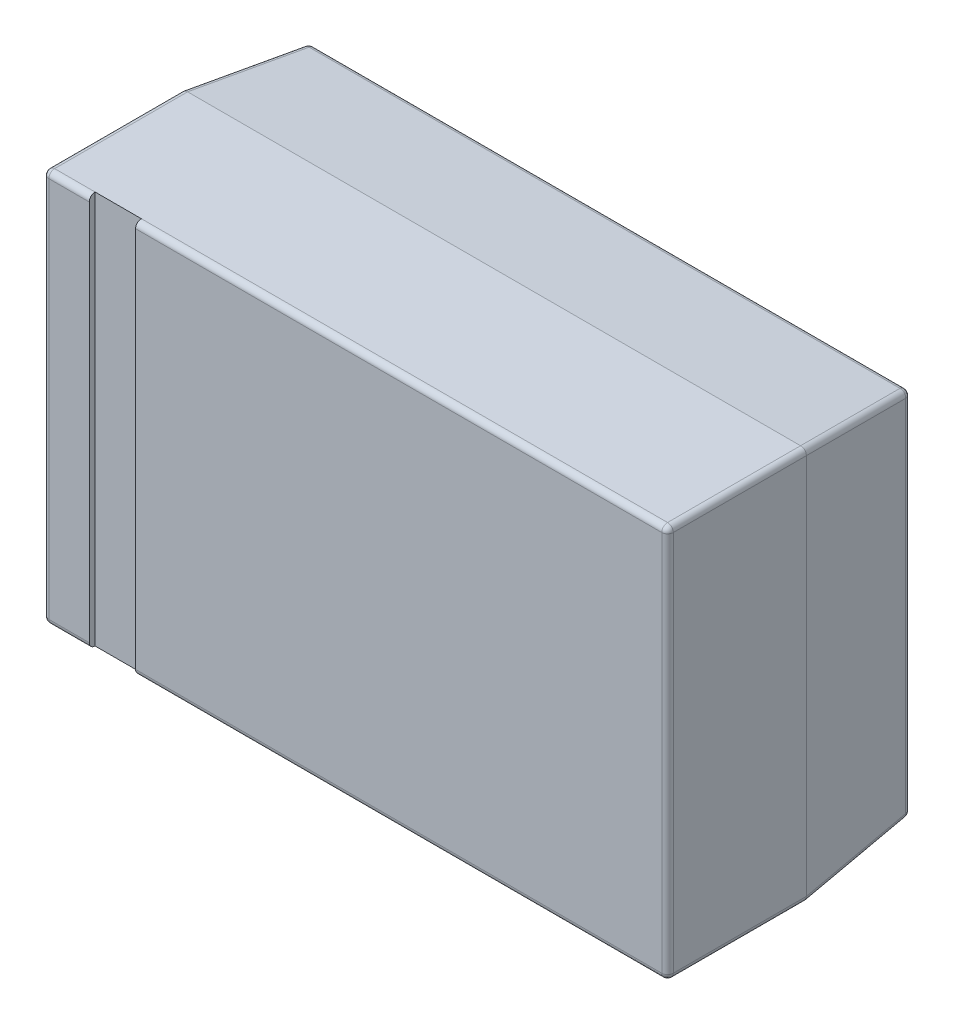
ISO-10303-21;
HEADER;
FILE_DESCRIPTION(('STEP AP214'),'2;1');
FILE_NAME('part.step','',(''),(''),'','','');
FILE_SCHEMA(('AUTOMOTIVE_DESIGN { 1 0 10303 214 1 1 1 1 }'));
ENDSEC;
DATA;
#1=APPLICATION_CONTEXT('core data for automotive mechanical design processes');
#2=APPLICATION_PROTOCOL_DEFINITION('international standard','automotive_design',2000,#1);
#3=PRODUCT_CONTEXT('',#1,'mechanical');
#4=PRODUCT('Part','Part','',(#3));
#5=PRODUCT_RELATED_PRODUCT_CATEGORY('part','',(#4));
#6=PRODUCT_DEFINITION_FORMATION('','',#4);
#7=PRODUCT_DEFINITION_CONTEXT('part definition',#1,'design');
#8=PRODUCT_DEFINITION('design','',#6,#7);
#9=PRODUCT_DEFINITION_SHAPE('','',#8);
#10=(LENGTH_UNIT() NAMED_UNIT(*) SI_UNIT(.MILLI.,.METRE.));
#11=(NAMED_UNIT(*) PLANE_ANGLE_UNIT() SI_UNIT($,.RADIAN.));
#12=(NAMED_UNIT(*) SI_UNIT($,.STERADIAN.) SOLID_ANGLE_UNIT());
#13=UNCERTAINTY_MEASURE_WITH_UNIT(LENGTH_MEASURE(1.E-05),#10,'distance_accuracy_value','');
#14=(GEOMETRIC_REPRESENTATION_CONTEXT(3) GLOBAL_UNCERTAINTY_ASSIGNED_CONTEXT((#13)) GLOBAL_UNIT_ASSIGNED_CONTEXT((#10,
#11,#12)) REPRESENTATION_CONTEXT('',''));
#15=CARTESIAN_POINT('',(0.,0.,0.));
#16=DIRECTION('',(0.,0.,1.));
#17=DIRECTION('',(1.,0.,0.));
#18=AXIS2_PLACEMENT_3D('',#15,#16,#17);
#19=CARTESIAN_POINT('',(1.2783753109472,-0.778375310947198,0.1));
#20=DIRECTION('',(0.,0.,-1.));
#21=DIRECTION('',(-1.,0.,0.));
#22=AXIS2_PLACEMENT_3D('',#19,#20,#21);
#23=PLANE('',#22);
#24=DIRECTION('',(1.,0.,0.));
#25=VECTOR('',#24,1.);
#26=CARTESIAN_POINT('',(0.,-0.777375310947198,0.1));
#27=LINE('',#26,#25);
#28=CARTESIAN_POINT('',(-1.2773753109472,-0.777375310947231,0.1));
#29=VERTEX_POINT('',#28);
#30=CARTESIAN_POINT('',(1.2773753109472,-0.777375310947198,0.1));
#31=VERTEX_POINT('',#30);
#32=EDGE_CURVE('E198',#29,#31,#27,.T.);
#33=ORIENTED_EDGE('',*,*,#32,.F.);
#34=DIRECTION('',(0.,1.,0.));
#35=VECTOR('',#34,1.);
#36=CARTESIAN_POINT('',(-1.2773753109472,0.,0.1));
#37=LINE('',#36,#35);
#38=CARTESIAN_POINT('',(-1.27737531094719,0.777375310947198,0.1));
#39=VERTEX_POINT('',#38);
#40=EDGE_CURVE('E145',#29,#39,#37,.T.);
#41=ORIENTED_EDGE('',*,*,#40,.T.);
#42=DIRECTION('',(-1.,0.,0.));
#43=VECTOR('',#42,1.);
#44=CARTESIAN_POINT('',(0.,0.777375310947198,0.1));
#45=LINE('',#44,#43);
#46=CARTESIAN_POINT('',(1.2773753109472,0.777375310947197,0.1));
#47=VERTEX_POINT('',#46);
#48=EDGE_CURVE('E144',#47,#39,#45,.T.);
#49=ORIENTED_EDGE('',*,*,#48,.F.);
#50=DIRECTION('',(0.,-1.,0.));
#51=VECTOR('',#50,1.);
#52=CARTESIAN_POINT('',(1.2773753109472,0.,0.1));
#53=LINE('',#52,#51);
#54=EDGE_CURVE('E209',#47,#31,#53,.T.);
#55=ORIENTED_EDGE('',*,*,#54,.T.);
#56=EDGE_LOOP('',(#33,#41,#49,#55));
#57=FACE_BOUND('',#56,.T.);
#58=ADVANCED_FACE('F17',(#57),#23,.T.);
#59=CARTESIAN_POINT('',(1.2773753109472,0.777375310947199,0.124999999999998));
#60=DIRECTION('',(0.343720256421982,-0.842800358685457,-0.41417863383433));
#61=DIRECTION('',(-0.156407681747957,0.383510857493112,-0.910195615939303));
#62=AXIS2_PLACEMENT_3D('',#59,#60,#61);
#63=SPHERICAL_SURFACE('',#62,0.0249999999999989);
#64=CARTESIAN_POINT('',(1.2773753109472,0.777375310947198,0.125));
#65=DIRECTION('',(1.,0.,0.));
#66=DIRECTION('',(0.,0.,-1.));
#67=AXIS2_PLACEMENT_3D('',#64,#65,#66);
#68=CIRCLE('',#67,0.0250000000000002);
#69=CARTESIAN_POINT('',(1.2773753109472,0.802251240702447,0.122512407024475));
#70=VERTEX_POINT('',#69);
#71=EDGE_CURVE('E21',#70,#47,#68,.F.);
#72=ORIENTED_EDGE('',*,*,#71,.F.);
#73=CARTESIAN_POINT('',(1.2773753109472,0.777375310947196,0.125));
#74=DIRECTION('',(-0.0990147542976653,-0.0990147542976635,-0.990147542976675));
#75=DIRECTION('',(-0.995037190209989,0.,0.0995037190209967));
#76=AXIS2_PLACEMENT_3D('',#73,#74,#75);
#77=CIRCLE('',#76,0.0250000000000023);
#78=CARTESIAN_POINT('',(1.30225124070245,0.777375310947197,0.122512407024475));
#79=VERTEX_POINT('',#78);
#80=EDGE_CURVE('E138',#79,#70,#77,.F.);
#81=ORIENTED_EDGE('',*,*,#80,.F.);
#82=CARTESIAN_POINT('',(1.2773753109472,0.777375310947197,0.125000000000002));
#83=DIRECTION('',(0.,-1.,0.));
#84=DIRECTION('',(0.,0.,-1.));
#85=AXIS2_PLACEMENT_3D('',#82,#83,#84);
#86=CIRCLE('',#85,0.0250000000000014);
#87=EDGE_CURVE('E140',#47,#79,#86,.T.);
#88=ORIENTED_EDGE('',*,*,#87,.F.);
#89=EDGE_LOOP('',(#72,#81,#88));
#90=FACE_BOUND('',#89,.T.);
#91=ADVANCED_FACE('F136',(#90),#63,.T.);
#92=CARTESIAN_POINT('',(1.2773753109472,-0.777375310947198,0.124999999999997));
#93=DIRECTION('',(-0.343720256422158,-0.842800358685331,0.414178633834441));
#94=DIRECTION('',(-0.156407681747989,-0.383510857493218,-0.910195615939253));
#95=AXIS2_PLACEMENT_3D('',#92,#93,#94);
#96=SPHERICAL_SURFACE('',#95,0.0249999999999985);
#97=CARTESIAN_POINT('',(1.2773753109472,-0.777375310947198,0.125));
#98=DIRECTION('',(-1.,0.,0.));
#99=DIRECTION('',(0.,0.,1.));
#100=AXIS2_PLACEMENT_3D('',#97,#98,#99);
#101=CIRCLE('',#100,0.0250000000000002);
#102=CARTESIAN_POINT('',(1.2773753109472,-0.802251240702437,0.122512407024476));
#103=VERTEX_POINT('',#102);
#104=EDGE_CURVE('E199',#31,#103,#101,.T.);
#105=ORIENTED_EDGE('',*,*,#104,.F.);
#106=CARTESIAN_POINT('',(1.2773753109472,-0.777375310947198,0.125000000000002));
#107=DIRECTION('',(0.,-1.,0.));
#108=DIRECTION('',(0.,0.,-1.));
#109=AXIS2_PLACEMENT_3D('',#106,#107,#108);
#110=CIRCLE('',#109,0.0250000000000014);
#111=CARTESIAN_POINT('',(1.30225124070245,-0.777375310947202,0.122512407024475));
#112=VERTEX_POINT('',#111);
#113=EDGE_CURVE('E168',#112,#31,#110,.F.);
#114=ORIENTED_EDGE('',*,*,#113,.F.);
#115=CARTESIAN_POINT('',(1.2773753109472,-0.777375310947176,0.125000000000003));
#116=DIRECTION('',(-0.0990147542976614,0.0990147542977063,-0.990147542976671));
#117=DIRECTION('',(0.,0.995037190209985,0.0995037190210379));
#118=AXIS2_PLACEMENT_3D('',#115,#116,#117);
#119=CIRCLE('',#118,0.0250000000000009);
#120=EDGE_CURVE('E167',#103,#112,#119,.F.);
#121=ORIENTED_EDGE('',*,*,#120,.F.);
#122=EDGE_LOOP('',(#105,#114,#121));
#123=FACE_BOUND('',#122,.T.);
#124=ADVANCED_FACE('F448',(#123),#96,.T.);
#125=CARTESIAN_POINT('',(-1.2773753109472,0.777375310947198,0.125));
#126=DIRECTION('',(1.,0.,0.));
#127=DIRECTION('',(0.,0.,-1.));
#128=AXIS2_PLACEMENT_3D('',#125,#126,#127);
#129=CYLINDRICAL_SURFACE('',#128,0.0250000000000002);
#130=ORIENTED_EDGE('',*,*,#71,.T.);
#131=ORIENTED_EDGE('',*,*,#48,.T.);
#132=CARTESIAN_POINT('',(-1.27737531094717,0.777375310947198,0.125));
#133=DIRECTION('',(1.,0.,0.));
#134=DIRECTION('',(0.,0.,-1.));
#135=AXIS2_PLACEMENT_3D('',#132,#133,#134);
#136=CIRCLE('',#135,0.0250000000000002);
#137=CARTESIAN_POINT('',(-1.27737531094718,0.802251240702443,0.122512407024477));
#138=VERTEX_POINT('',#137);
#139=EDGE_CURVE('E150',#138,#39,#136,.F.);
#140=ORIENTED_EDGE('',*,*,#139,.F.);
#141=DIRECTION('',(-1.,0.,0.));
#142=VECTOR('',#141,1.);
#143=CARTESIAN_POINT('',(0.,0.802251240702447,0.122512407024475));
#144=LINE('',#143,#142);
#145=EDGE_CURVE('E147',#70,#138,#144,.T.);
#146=ORIENTED_EDGE('',*,*,#145,.F.);
#147=EDGE_LOOP('',(#130,#131,#140,#146));
#148=FACE_BOUND('',#147,.T.);
#149=ADVANCED_FACE('F148',(#148),#129,.T.);
#150=CARTESIAN_POINT('',(1.2773753109472,-0.777375310947198,0.125));
#151=DIRECTION('',(-1.,0.,0.));
#152=DIRECTION('',(0.,0.,1.));
#153=AXIS2_PLACEMENT_3D('',#150,#151,#152);
#154=CYLINDRICAL_SURFACE('',#153,0.0250000000000002);
#155=CARTESIAN_POINT('',(-1.2773753109472,-0.777375310947198,0.125));
#156=DIRECTION('',(-1.,0.,0.));
#157=DIRECTION('',(0.,0.,1.));
#158=AXIS2_PLACEMENT_3D('',#155,#156,#157);
#159=CIRCLE('',#158,0.0250000000000002);
#160=CARTESIAN_POINT('',(-1.27737531094718,-0.802251240702447,0.122512407024475));
#161=VERTEX_POINT('',#160);
#162=EDGE_CURVE('E156',#29,#161,#159,.T.);
#163=ORIENTED_EDGE('',*,*,#162,.F.);
#164=ORIENTED_EDGE('',*,*,#32,.T.);
#165=ORIENTED_EDGE('',*,*,#104,.T.);
#166=DIRECTION('',(1.,0.,0.));
#167=VECTOR('',#166,1.);
#168=CARTESIAN_POINT('',(0.,-0.802251240702447,0.122512407024475));
#169=LINE('',#168,#167);
#170=EDGE_CURVE('E174',#161,#103,#169,.T.);
#171=ORIENTED_EDGE('',*,*,#170,.F.);
#172=EDGE_LOOP('',(#163,#164,#165,#171));
#173=FACE_BOUND('',#172,.T.);
#174=ADVANCED_FACE('F441',(#173),#154,.T.);
#175=CARTESIAN_POINT('',(1.2773753109472,0.777375310947198,0.125000000000002));
#176=DIRECTION('',(0.,-1.,0.));
#177=DIRECTION('',(0.,0.,-1.));
#178=AXIS2_PLACEMENT_3D('',#175,#176,#177);
#179=CYLINDRICAL_SURFACE('',#178,0.0250000000000014);
#180=ORIENTED_EDGE('',*,*,#113,.T.);
#181=ORIENTED_EDGE('',*,*,#54,.F.);
#182=ORIENTED_EDGE('',*,*,#87,.T.);
#183=DIRECTION('',(0.,1.,0.));
#184=VECTOR('',#183,1.);
#185=CARTESIAN_POINT('',(1.30225124070245,0.,0.122512407024475));
#186=LINE('',#185,#184);
#187=EDGE_CURVE('E327',#112,#79,#186,.T.);
#188=ORIENTED_EDGE('',*,*,#187,.F.);
#189=EDGE_LOOP('',(#180,#181,#182,#188));
#190=FACE_BOUND('',#189,.T.);
#191=ADVANCED_FACE('F446',(#190),#179,.T.);
#192=CARTESIAN_POINT('',(1.325,0.824999999999997,0.601246890528024));
#193=DIRECTION('',(-0.0990147542976653,-0.0990147542976635,-0.990147542976675));
#194=DIRECTION('',(-0.995037190209989,0.,0.0995037190209967));
#195=AXIS2_PLACEMENT_3D('',#192,#193,#194);
#196=CYLINDRICAL_SURFACE('',#195,0.0250000000000023);
#197=ORIENTED_EDGE('',*,*,#80,.T.);
#198=DIRECTION('',(-0.0990147542976628,-0.0990147542976693,-0.990147542976675));
#199=VECTOR('',#198,1.);
#200=CARTESIAN_POINT('',(1.325,0.84987592975525,0.598759297552498));
#201=LINE('',#200,#199);
#202=CARTESIAN_POINT('',(1.325,0.849937964877625,0.60000309404026));
#203=VERTEX_POINT('',#202);
#204=EDGE_CURVE('E155',#203,#70,#201,.T.);
#205=ORIENTED_EDGE('',*,*,#204,.F.);
#206=CARTESIAN_POINT('',(1.325,0.824999999999999,0.601246890528042));
#207=DIRECTION('',(-0.0496297718696279,-0.0496297718696271,-0.997533844783392));
#208=DIRECTION('',(0.705362946109432,0.70536294610942,-0.0701870964755097));
#209=AXIS2_PLACEMENT_3D('',#206,#207,#208);
#210=ELLIPSE('',#209,0.0250618063043563,0.0250000000000012);
#211=CARTESIAN_POINT('',(1.34993796487762,0.825,0.60000309404026));
#212=VERTEX_POINT('',#211);
#213=EDGE_CURVE('E333',#212,#203,#210,.F.);
#214=ORIENTED_EDGE('',*,*,#213,.F.);
#215=DIRECTION('',(0.0990147542976583,0.0990147542976696,0.990147542976675));
#216=VECTOR('',#215,1.);
#217=CARTESIAN_POINT('',(1.30225124070245,0.777375310947197,0.122512407024475));
#218=LINE('',#217,#216);
#219=EDGE_CURVE('E165',#79,#212,#218,.T.);
#220=ORIENTED_EDGE('',*,*,#219,.F.);
#221=EDGE_LOOP('',(#197,#205,#214,#220));
#222=FACE_BOUND('',#221,.T.);
#223=ADVANCED_FACE('F161',(#222),#196,.T.);
#224=CARTESIAN_POINT('',(1.325,-0.824999999999997,0.601246890528024));
#225=DIRECTION('',(-0.0990147542976614,0.0990147542977063,-0.990147542976671));
#226=DIRECTION('',(0.,0.995037190209985,0.0995037190210379));
#227=AXIS2_PLACEMENT_3D('',#224,#225,#226);
#228=CYLINDRICAL_SURFACE('',#227,0.0250000000000009);
#229=ORIENTED_EDGE('',*,*,#120,.T.);
#230=DIRECTION('',(-0.0990147542976583,0.0990147542976691,-0.990147542976675));
#231=VECTOR('',#230,1.);
#232=CARTESIAN_POINT('',(1.34987592975525,-0.825,0.598759297552498));
#233=LINE('',#232,#231);
#234=CARTESIAN_POINT('',(1.34993796487762,-0.825,0.600003094040261));
#235=VERTEX_POINT('',#234);
#236=EDGE_CURVE('E321',#235,#112,#233,.T.);
#237=ORIENTED_EDGE('',*,*,#236,.F.);
#238=CARTESIAN_POINT('',(1.325,-0.824999999999999,0.601246890528041));
#239=DIRECTION('',(-0.0496297718696261,0.0496297718696486,-0.997533844783392));
#240=DIRECTION('',(0.705362946109265,-0.705362946109585,-0.0701870964755227));
#241=AXIS2_PLACEMENT_3D('',#238,#239,#240);
#242=ELLIPSE('',#241,0.0250618063043556,0.0250000000000004);
#243=CARTESIAN_POINT('',(1.325,-0.849937964877625,0.60000309404026));
#244=VERTEX_POINT('',#243);
#245=EDGE_CURVE('E330',#244,#235,#242,.F.);
#246=ORIENTED_EDGE('',*,*,#245,.F.);
#247=DIRECTION('',(0.0990147542976844,-0.0990147542976691,0.990147542976673));
#248=VECTOR('',#247,1.);
#249=CARTESIAN_POINT('',(1.27737531094719,-0.802251240702447,0.122512407024476));
#250=LINE('',#249,#248);
#251=EDGE_CURVE('E177',#103,#244,#250,.T.);
#252=ORIENTED_EDGE('',*,*,#251,.F.);
#253=EDGE_LOOP('',(#229,#237,#246,#252));
#254=FACE_BOUND('',#253,.T.);
#255=ADVANCED_FACE('F449',(#254),#228,.T.);
#256=CARTESIAN_POINT('',(-1.2773753109472,0.777375310947196,0.124999999999998));
#257=DIRECTION('',(-0.343720256422116,-0.842800358685272,-0.414178633834595));
#258=DIRECTION('',(-0.934672634019383,0.349680228178148,0.0641155615786589));
#259=AXIS2_PLACEMENT_3D('',#256,#257,#258);
#260=SPHERICAL_SURFACE('',#259,0.0250000000000024);
#261=ORIENTED_EDGE('',*,*,#139,.T.);
#262=CARTESIAN_POINT('',(-1.2773753109472,0.777375310947198,0.125000000000002));
#263=DIRECTION('',(0.,1.,0.));
#264=DIRECTION('',(0.,0.,1.));
#265=AXIS2_PLACEMENT_3D('',#262,#263,#264);
#266=CIRCLE('',#265,0.0250000000000014);
#267=CARTESIAN_POINT('',(-1.30225124070245,0.777375310947201,0.122512407024475));
#268=VERTEX_POINT('',#267);
#269=EDGE_CURVE('E190',#268,#39,#266,.F.);
#270=ORIENTED_EDGE('',*,*,#269,.F.);
#271=CARTESIAN_POINT('',(-1.2773753109472,0.777375310947176,0.125000000000003));
#272=DIRECTION('',(0.0990147542976614,-0.0990147542977063,-0.990147542976671));
#273=DIRECTION('',(0.,0.995037190209985,-0.0995037190210379));
#274=AXIS2_PLACEMENT_3D('',#271,#272,#273);
#275=CIRCLE('',#274,0.0250000000000009);
#276=EDGE_CURVE('E317',#138,#268,#275,.F.);
#277=ORIENTED_EDGE('',*,*,#276,.F.);
#278=EDGE_LOOP('',(#261,#270,#277));
#279=FACE_BOUND('',#278,.T.);
#280=ADVANCED_FACE('F451',(#279),#260,.T.);
#281=CARTESIAN_POINT('',(-1.2773753109472,-0.777375310947198,0.125000000000002));
#282=DIRECTION('',(0.,1.,0.));
#283=DIRECTION('',(0.,0.,1.));
#284=AXIS2_PLACEMENT_3D('',#281,#282,#283);
#285=CYLINDRICAL_SURFACE('',#284,0.0250000000000014);
#286=ORIENTED_EDGE('',*,*,#269,.T.);
#287=ORIENTED_EDGE('',*,*,#40,.F.);
#288=CARTESIAN_POINT('',(-1.2773753109472,-0.777375310947264,0.125000000000002));
#289=DIRECTION('',(0.,1.,0.));
#290=DIRECTION('',(0.,0.,1.));
#291=AXIS2_PLACEMENT_3D('',#288,#289,#290);
#292=CIRCLE('',#291,0.0250000000000014);
#293=CARTESIAN_POINT('',(-1.30225124070245,-0.777375310947265,0.122512407024512));
#294=VERTEX_POINT('',#293);
#295=EDGE_CURVE('E187',#294,#29,#292,.F.);
#296=ORIENTED_EDGE('',*,*,#295,.F.);
#297=DIRECTION('',(0.,-1.,0.));
#298=VECTOR('',#297,1.);
#299=CARTESIAN_POINT('',(-1.30225124070245,0.,0.122512407024475));
#300=LINE('',#299,#298);
#301=EDGE_CURVE('E314',#268,#294,#300,.T.);
#302=ORIENTED_EDGE('',*,*,#301,.F.);
#303=EDGE_LOOP('',(#286,#287,#296,#302));
#304=FACE_BOUND('',#303,.T.);
#305=ADVANCED_FACE('F458',(#304),#285,.T.);
#306=CARTESIAN_POINT('',(-1.2773753109472,-0.777375310947196,0.124999999999999));
#307=DIRECTION('',(0.343720256422438,-0.842800358685044,0.414178633834792));
#308=DIRECTION('',(-0.934672634019255,-0.349680228178464,0.0641155615787961));
#309=AXIS2_PLACEMENT_3D('',#306,#307,#308);
#310=SPHERICAL_SURFACE('',#309,0.0250000000000012);
#311=ORIENTED_EDGE('',*,*,#295,.T.);
#312=ORIENTED_EDGE('',*,*,#162,.T.);
#313=CARTESIAN_POINT('',(-1.2773753109472,-0.777375310947192,0.124999999999998));
#314=DIRECTION('',(0.0990147542976696,0.0990147542976718,-0.990147542976674));
#315=DIRECTION('',(0.,0.995037190209989,0.0995037190210033));
#316=AXIS2_PLACEMENT_3D('',#313,#314,#315);
#317=CIRCLE('',#316,0.0250000000000024);
#318=EDGE_CURVE('E307',#294,#161,#317,.F.);
#319=ORIENTED_EDGE('',*,*,#318,.F.);
#320=EDGE_LOOP('',(#311,#312,#319));
#321=FACE_BOUND('',#320,.T.);
#322=ADVANCED_FACE('F439',(#321),#310,.T.);
#323=CARTESIAN_POINT('',(-1.326,0.802151736983426,0.121517369834265));
#324=DIRECTION('',(0.,0.995037190209989,-0.0995037190210007));
#325=DIRECTION('',(0.,0.0995037190210007,0.995037190209989));
#326=AXIS2_PLACEMENT_3D('',#323,#324,#325);
#327=PLANE('',#326);
#328=DIRECTION('',(-1.,0.,0.));
#329=VECTOR('',#328,1.);
#330=CARTESIAN_POINT('',(1.326,0.85,0.599999999999995));
#331=LINE('',#330,#329);
#332=CARTESIAN_POINT('',(-1.325,0.849937964877625,0.60000309404026));
#333=VERTEX_POINT('',#332);
#334=EDGE_CURVE('E172',#203,#333,#331,.T.);
#335=ORIENTED_EDGE('',*,*,#334,.F.);
#336=ORIENTED_EDGE('',*,*,#204,.T.);
#337=ORIENTED_EDGE('',*,*,#145,.T.);
#338=DIRECTION('',(0.099014754297684,-0.0990147542976669,-0.990147542976673));
#339=VECTOR('',#338,1.);
#340=CARTESIAN_POINT('',(-1.30118765547359,0.826063585228848,0.360635852288487));
#341=LINE('',#340,#339);
#342=EDGE_CURVE('E320',#333,#138,#341,.T.);
#343=ORIENTED_EDGE('',*,*,#342,.F.);
#344=EDGE_LOOP('',(#335,#336,#337,#343));
#345=FACE_BOUND('',#344,.T.);
#346=ADVANCED_FACE('F170',(#345),#327,.T.);
#347=CARTESIAN_POINT('',(-1.326,-0.849975433474271,0.599754334742708));
#348=DIRECTION('',(0.,-0.995037190209989,-0.0995037190210007));
#349=DIRECTION('',(0.,0.0995037190210007,-0.995037190209989));
#350=AXIS2_PLACEMENT_3D('',#347,#348,#349);
#351=PLANE('',#350);
#352=DIRECTION('',(1.,0.,0.));
#353=VECTOR('',#352,1.);
#354=CARTESIAN_POINT('',(-1.326,-0.85,0.599999999999995));
#355=LINE('',#354,#353);
#356=CARTESIAN_POINT('',(-1.325,-0.849937964877625,0.60000309404026));
#357=VERTEX_POINT('',#356);
#358=EDGE_CURVE('E295',#357,#244,#355,.T.);
#359=ORIENTED_EDGE('',*,*,#358,.F.);
#360=DIRECTION('',(-0.0990147542976628,-0.0990147542976689,0.990147542976675));
#361=VECTOR('',#360,1.);
#362=CARTESIAN_POINT('',(-1.3011876554736,-0.826063585228848,0.360635852288487));
#363=LINE('',#362,#361);
#364=EDGE_CURVE('E304',#161,#357,#363,.T.);
#365=ORIENTED_EDGE('',*,*,#364,.F.);
#366=ORIENTED_EDGE('',*,*,#170,.T.);
#367=ORIENTED_EDGE('',*,*,#251,.T.);
#368=EDGE_LOOP('',(#359,#365,#366,#367));
#369=FACE_BOUND('',#368,.T.);
#370=ADVANCED_FACE('F342',(#369),#351,.T.);
#371=CARTESIAN_POINT('',(1.325,0.825,1.175));
#372=DIRECTION('',(0.,0.,-1.));
#373=DIRECTION('',(-1.,0.,0.));
#374=AXIS2_PLACEMENT_3D('',#371,#372,#373);
#375=CYLINDRICAL_SURFACE('',#374,0.025);
#376=ORIENTED_EDGE('',*,*,#213,.T.);
#377=DIRECTION('',(0.,0.,-1.));
#378=VECTOR('',#377,1.);
#379=CARTESIAN_POINT('',(1.325,0.85,0.888123445264011));
#380=LINE('',#379,#378);
#381=CARTESIAN_POINT('',(1.325,0.85,1.175));
#382=VERTEX_POINT('',#381);
#383=EDGE_CURVE('E299',#382,#203,#380,.T.);
#384=ORIENTED_EDGE('',*,*,#383,.F.);
#385=CARTESIAN_POINT('',(1.325,0.825,1.175));
#386=DIRECTION('',(0.,0.,-1.));
#387=DIRECTION('',(-1.,0.,0.));
#388=AXIS2_PLACEMENT_3D('',#385,#386,#387);
#389=CIRCLE('',#388,0.025);
#390=CARTESIAN_POINT('',(1.35,0.825,1.175));
#391=VERTEX_POINT('',#390);
#392=EDGE_CURVE('E291',#391,#382,#389,.F.);
#393=ORIENTED_EDGE('',*,*,#392,.F.);
#394=DIRECTION('',(0.,0.,1.));
#395=VECTOR('',#394,1.);
#396=CARTESIAN_POINT('',(1.35,0.825,0.888123445264011));
#397=LINE('',#396,#395);
#398=EDGE_CURVE('E290',#212,#391,#397,.T.);
#399=ORIENTED_EDGE('',*,*,#398,.F.);
#400=EDGE_LOOP('',(#376,#384,#393,#399));
#401=FACE_BOUND('',#400,.T.);
#402=ADVANCED_FACE('F389',(#401),#375,.T.);
#403=CARTESIAN_POINT('',(1.325,-0.825,1.175));
#404=DIRECTION('',(0.,0.,-1.));
#405=DIRECTION('',(-1.,0.,0.));
#406=AXIS2_PLACEMENT_3D('',#403,#404,#405);
#407=CYLINDRICAL_SURFACE('',#406,0.025);
#408=ORIENTED_EDGE('',*,*,#245,.T.);
#409=DIRECTION('',(0.,0.,-1.));
#410=VECTOR('',#409,1.);
#411=CARTESIAN_POINT('',(1.35,-0.825,0.888123445264011));
#412=LINE('',#411,#410);
#413=CARTESIAN_POINT('',(1.35,-0.825,1.175));
#414=VERTEX_POINT('',#413);
#415=EDGE_CURVE('E284',#414,#235,#412,.T.);
#416=ORIENTED_EDGE('',*,*,#415,.F.);
#417=CARTESIAN_POINT('',(1.325,-0.825,1.175));
#418=DIRECTION('',(0.,0.,-1.));
#419=DIRECTION('',(-1.,0.,0.));
#420=AXIS2_PLACEMENT_3D('',#417,#418,#419);
#421=CIRCLE('',#420,0.025);
#422=CARTESIAN_POINT('',(1.325,-0.85,1.175));
#423=VERTEX_POINT('',#422);
#424=EDGE_CURVE('E287',#423,#414,#421,.F.);
#425=ORIENTED_EDGE('',*,*,#424,.F.);
#426=DIRECTION('',(0.,0.,1.));
#427=VECTOR('',#426,1.);
#428=CARTESIAN_POINT('',(1.325,-0.85,0.888123445264011));
#429=LINE('',#428,#427);
#430=EDGE_CURVE('E298',#244,#423,#429,.T.);
#431=ORIENTED_EDGE('',*,*,#430,.F.);
#432=EDGE_LOOP('',(#408,#416,#425,#431));
#433=FACE_BOUND('',#432,.T.);
#434=ADVANCED_FACE('F349',(#433),#407,.T.);
#435=CARTESIAN_POINT('',(1.34997543347427,-0.826,0.599754334742708));
#436=DIRECTION('',(0.99503719020999,0.,-0.0995037190209897));
#437=DIRECTION('',(-0.0995037190209897,0.,-0.99503719020999));
#438=AXIS2_PLACEMENT_3D('',#435,#436,#437);
#439=PLANE('',#438);
#440=DIRECTION('',(0.,1.,0.));
#441=VECTOR('',#440,1.);
#442=CARTESIAN_POINT('',(1.35,-0.826,0.600000000000009));
#443=LINE('',#442,#441);
#444=EDGE_CURVE('E281',#235,#212,#443,.T.);
#445=ORIENTED_EDGE('',*,*,#444,.F.);
#446=ORIENTED_EDGE('',*,*,#236,.T.);
#447=ORIENTED_EDGE('',*,*,#187,.T.);
#448=ORIENTED_EDGE('',*,*,#219,.T.);
#449=EDGE_LOOP('',(#445,#446,#447,#448));
#450=FACE_BOUND('',#449,.T.);
#451=ADVANCED_FACE('F396',(#450),#439,.T.);
#452=CARTESIAN_POINT('',(-1.325,0.824999999999997,0.601246890528024));
#453=DIRECTION('',(0.0990147542976614,-0.0990147542977063,-0.990147542976671));
#454=DIRECTION('',(0.,0.995037190209985,-0.0995037190210379));
#455=AXIS2_PLACEMENT_3D('',#452,#453,#454);
#456=CYLINDRICAL_SURFACE('',#455,0.0250000000000009);
#457=ORIENTED_EDGE('',*,*,#276,.T.);
#458=DIRECTION('',(0.0990147542976579,-0.0990147542976682,-0.990147542976675));
#459=VECTOR('',#458,1.);
#460=CARTESIAN_POINT('',(-1.34987592975525,0.824999999999999,0.598759297552498));
#461=LINE('',#460,#459);
#462=CARTESIAN_POINT('',(-1.34993796487762,0.825,0.60000309404026));
#463=VERTEX_POINT('',#462);
#464=EDGE_CURVE('E311',#463,#268,#461,.T.);
#465=ORIENTED_EDGE('',*,*,#464,.F.);
#466=CARTESIAN_POINT('',(-1.325,0.824999999999999,0.601246890528041));
#467=DIRECTION('',(0.0496297718696261,-0.0496297718696486,-0.997533844783392));
#468=DIRECTION('',(-0.705362946109265,0.705362946109585,-0.0701870964755227));
#469=AXIS2_PLACEMENT_3D('',#466,#467,#468);
#470=ELLIPSE('',#469,0.0250618063043556,0.0250000000000004);
#471=EDGE_CURVE('E273',#333,#463,#470,.F.);
#472=ORIENTED_EDGE('',*,*,#471,.F.);
#473=ORIENTED_EDGE('',*,*,#342,.T.);
#474=EDGE_LOOP('',(#457,#465,#472,#473));
#475=FACE_BOUND('',#474,.T.);
#476=ADVANCED_FACE('F713',(#475),#456,.T.);
#477=CARTESIAN_POINT('',(-1.30215173698343,-0.826,0.121517369834265));
#478=DIRECTION('',(-0.99503719020999,0.,-0.0995037190209897));
#479=DIRECTION('',(-0.0995037190209897,0.,0.99503719020999));
#480=AXIS2_PLACEMENT_3D('',#477,#478,#479);
#481=PLANE('',#480);
#482=DIRECTION('',(0.,-1.,0.));
#483=VECTOR('',#482,1.);
#484=CARTESIAN_POINT('',(-1.35,0.826,0.600000000000009));
#485=LINE('',#484,#483);
#486=CARTESIAN_POINT('',(-1.34993796487763,-0.825,0.60000309404026));
#487=VERTEX_POINT('',#486);
#488=EDGE_CURVE('E269',#463,#487,#485,.T.);
#489=ORIENTED_EDGE('',*,*,#488,.F.);
#490=ORIENTED_EDGE('',*,*,#464,.T.);
#491=ORIENTED_EDGE('',*,*,#301,.T.);
#492=DIRECTION('',(0.0990147542976637,0.0990147542976689,-0.990147542976675));
#493=VECTOR('',#492,1.);
#494=CARTESIAN_POINT('',(-1.32606358522885,-0.801187655473599,0.360635852288487));
#495=LINE('',#494,#493);
#496=EDGE_CURVE('E310',#487,#294,#495,.T.);
#497=ORIENTED_EDGE('',*,*,#496,.F.);
#498=EDGE_LOOP('',(#489,#490,#491,#497));
#499=FACE_BOUND('',#498,.T.);
#500=ADVANCED_FACE('F436',(#499),#481,.T.);
#501=CARTESIAN_POINT('',(-1.325,-0.824999999999997,0.601246890528024));
#502=DIRECTION('',(0.0990147542976696,0.0990147542976718,-0.990147542976674));
#503=DIRECTION('',(0.,0.995037190209989,0.0995037190210033));
#504=AXIS2_PLACEMENT_3D('',#501,#502,#503);
#505=CYLINDRICAL_SURFACE('',#504,0.0250000000000024);
#506=ORIENTED_EDGE('',*,*,#318,.T.);
#507=ORIENTED_EDGE('',*,*,#364,.T.);
#508=CARTESIAN_POINT('',(-1.325,-0.825,0.601246890528054));
#509=DIRECTION('',(0.0496297718696301,0.0496297718696312,-0.997533844783392));
#510=DIRECTION('',(-0.705362946109418,-0.705362946109433,-0.0701870964755131));
#511=AXIS2_PLACEMENT_3D('',#508,#509,#510);
#512=ELLIPSE('',#511,0.0250618063043563,0.0250000000000012);
#513=EDGE_CURVE('E263',#487,#357,#512,.F.);
#514=ORIENTED_EDGE('',*,*,#513,.F.);
#515=ORIENTED_EDGE('',*,*,#496,.T.);
#516=EDGE_LOOP('',(#506,#507,#514,#515));
#517=FACE_BOUND('',#516,.T.);
#518=ADVANCED_FACE('F371',(#517),#505,.T.);
#519=CARTESIAN_POINT('',(1.326,0.85,0.600246890528022));
#520=DIRECTION('',(0.,1.,0.));
#521=DIRECTION('',(-1.,0.,0.));
#522=AXIS2_PLACEMENT_3D('',#519,#520,#521);
#523=PLANE('',#522);
#524=DIRECTION('',(-1.,0.,0.));
#525=VECTOR('',#524,1.);
#526=CARTESIAN_POINT('',(0.1875,0.85,1.175));
#527=LINE('',#526,#525);
#528=CARTESIAN_POINT('',(-0.95,0.85,1.175));
#529=VERTEX_POINT('',#528);
#530=EDGE_CURVE('E256',#382,#529,#527,.T.);
#531=ORIENTED_EDGE('',*,*,#530,.F.);
#532=ORIENTED_EDGE('',*,*,#383,.T.);
#533=ORIENTED_EDGE('',*,*,#334,.T.);
#534=DIRECTION('',(0.,0.,-1.));
#535=VECTOR('',#534,1.);
#536=CARTESIAN_POINT('',(-1.325,0.85,0.888123445264011));
#537=LINE('',#536,#535);
#538=CARTESIAN_POINT('',(-1.325,0.85,1.175));
#539=VERTEX_POINT('',#538);
#540=EDGE_CURVE('E278',#539,#333,#537,.T.);
#541=ORIENTED_EDGE('',*,*,#540,.F.);
#542=DIRECTION('',(1.,0.,0.));
#543=VECTOR('',#542,1.);
#544=CARTESIAN_POINT('',(0.,0.85,1.175));
#545=LINE('',#544,#543);
#546=CARTESIAN_POINT('',(-1.15,0.85,1.175));
#547=VERTEX_POINT('',#546);
#548=EDGE_CURVE('E303',#539,#547,#545,.T.);
#549=ORIENTED_EDGE('',*,*,#548,.T.);
#550=DIRECTION('',(1.,0.,0.));
#551=VECTOR('',#550,1.);
#552=CARTESIAN_POINT('',(0.,0.85,1.175));
#553=LINE('',#552,#551);
#554=EDGE_CURVE('E416',#547,#529,#553,.T.);
#555=ORIENTED_EDGE('',*,*,#554,.T.);
#556=EDGE_LOOP('',(#531,#532,#533,#541,#549,#555));
#557=FACE_BOUND('',#556,.T.);
#558=ADVANCED_FACE('F481',(#557),#523,.T.);
#559=CARTESIAN_POINT('',(-1.326,-0.85,0.600246890528022));
#560=DIRECTION('',(0.,-1.,0.));
#561=DIRECTION('',(1.,0.,0.));
#562=AXIS2_PLACEMENT_3D('',#559,#560,#561);
#563=PLANE('',#562);
#564=DIRECTION('',(-1.,0.,0.));
#565=VECTOR('',#564,1.);
#566=CARTESIAN_POINT('',(0.,-0.85,1.175));
#567=LINE('',#566,#565);
#568=CARTESIAN_POINT('',(-1.15,-0.85,1.175));
#569=VERTEX_POINT('',#568);
#570=CARTESIAN_POINT('',(-1.32499999999999,-0.85,1.175));
#571=VERTEX_POINT('',#570);
#572=EDGE_CURVE('E294',#569,#571,#567,.T.);
#573=ORIENTED_EDGE('',*,*,#572,.T.);
#574=DIRECTION('',(0.,0.,1.));
#575=VECTOR('',#574,1.);
#576=CARTESIAN_POINT('',(-1.325,-0.85,0.888123445264011));
#577=LINE('',#576,#575);
#578=EDGE_CURVE('E262',#357,#571,#577,.T.);
#579=ORIENTED_EDGE('',*,*,#578,.F.);
#580=ORIENTED_EDGE('',*,*,#358,.T.);
#581=ORIENTED_EDGE('',*,*,#430,.T.);
#582=DIRECTION('',(1.,0.,0.));
#583=VECTOR('',#582,1.);
#584=CARTESIAN_POINT('',(0.1875,-0.85,1.175));
#585=LINE('',#584,#583);
#586=CARTESIAN_POINT('',(-0.95,-0.85,1.175));
#587=VERTEX_POINT('',#586);
#588=EDGE_CURVE('E252',#587,#423,#585,.T.);
#589=ORIENTED_EDGE('',*,*,#588,.F.);
#590=DIRECTION('',(-1.,0.,0.));
#591=VECTOR('',#590,1.);
#592=CARTESIAN_POINT('',(0.,-0.85,1.175));
#593=LINE('',#592,#591);
#594=EDGE_CURVE('E355',#587,#569,#593,.T.);
#595=ORIENTED_EDGE('',*,*,#594,.T.);
#596=EDGE_LOOP('',(#573,#579,#580,#581,#589,#595));
#597=FACE_BOUND('',#596,.T.);
#598=ADVANCED_FACE('F358',(#597),#563,.T.);
#599=CARTESIAN_POINT('',(1.32499999999998,0.824999999999994,1.17499999999998));
#600=DIRECTION('',(-0.816496580927466,0.408248290464322,0.408248290463923));
#601=DIRECTION('',(0.365148371670367,-0.182574185834677,0.91287092917525));
#602=AXIS2_PLACEMENT_3D('',#599,#600,#601);
#603=SPHERICAL_SURFACE('',#602,0.0250000000000225);
#604=ORIENTED_EDGE('',*,*,#392,.T.);
#605=CARTESIAN_POINT('',(1.325,0.825,1.175));
#606=DIRECTION('',(1.,0.,0.));
#607=DIRECTION('',(0.,0.,-1.));
#608=AXIS2_PLACEMENT_3D('',#605,#606,#607);
#609=CIRCLE('',#608,0.0249999999999999);
#610=CARTESIAN_POINT('',(1.325,0.825,1.2));
#611=VERTEX_POINT('',#610);
#612=EDGE_CURVE('E257',#611,#382,#609,.F.);
#613=ORIENTED_EDGE('',*,*,#612,.F.);
#614=CARTESIAN_POINT('',(1.325,0.825,1.175));
#615=DIRECTION('',(0.,-1.,0.));
#616=DIRECTION('',(0.,0.,-1.));
#617=AXIS2_PLACEMENT_3D('',#614,#615,#616);
#618=CIRCLE('',#617,0.025);
#619=EDGE_CURVE('E246',#391,#611,#618,.T.);
#620=ORIENTED_EDGE('',*,*,#619,.F.);
#621=EDGE_LOOP('',(#604,#613,#620));
#622=FACE_BOUND('',#621,.T.);
#623=ADVANCED_FACE('F542',(#622),#603,.T.);
#624=CARTESIAN_POINT('',(1.32499999999998,-0.824999999999958,1.17499999999998));
#625=DIRECTION('',(-0.408248290463491,-0.816496580928089,-0.40824829046351));
#626=DIRECTION('',(0.912870929175443,-0.365148371670369,-0.182574185833707));
#627=AXIS2_PLACEMENT_3D('',#624,#625,#626);
#628=SPHERICAL_SURFACE('',#627,0.0250000000000314);
#629=ORIENTED_EDGE('',*,*,#424,.T.);
#630=CARTESIAN_POINT('',(1.325,-0.825,1.175));
#631=DIRECTION('',(0.,-1.,0.));
#632=DIRECTION('',(0.,0.,-1.));
#633=AXIS2_PLACEMENT_3D('',#630,#631,#632);
#634=CIRCLE('',#633,0.025);
#635=CARTESIAN_POINT('',(1.325,-0.825,1.2));
#636=VERTEX_POINT('',#635);
#637=EDGE_CURVE('E243',#636,#414,#634,.F.);
#638=ORIENTED_EDGE('',*,*,#637,.F.);
#639=CARTESIAN_POINT('',(1.325,-0.825,1.175));
#640=DIRECTION('',(-1.,0.,0.));
#641=DIRECTION('',(0.,0.,1.));
#642=AXIS2_PLACEMENT_3D('',#639,#640,#641);
#643=CIRCLE('',#642,0.0249999999999999);
#644=EDGE_CURVE('E249',#423,#636,#643,.T.);
#645=ORIENTED_EDGE('',*,*,#644,.F.);
#646=EDGE_LOOP('',(#629,#638,#645));
#647=FACE_BOUND('',#646,.T.);
#648=ADVANCED_FACE('F544',(#647),#628,.T.);
#649=CARTESIAN_POINT('',(1.35,-0.826,0.600246890528022));
#650=DIRECTION('',(1.,0.,0.));
#651=DIRECTION('',(0.,1.,0.));
#652=AXIS2_PLACEMENT_3D('',#649,#650,#651);
#653=PLANE('',#652);
#654=ORIENTED_EDGE('',*,*,#415,.T.);
#655=ORIENTED_EDGE('',*,*,#444,.T.);
#656=ORIENTED_EDGE('',*,*,#398,.T.);
#657=DIRECTION('',(0.,1.,0.));
#658=VECTOR('',#657,1.);
#659=CARTESIAN_POINT('',(1.35,0.,1.175));
#660=LINE('',#659,#658);
#661=EDGE_CURVE('E242',#414,#391,#660,.T.);
#662=ORIENTED_EDGE('',*,*,#661,.F.);
#663=EDGE_LOOP('',(#654,#655,#656,#662));
#664=FACE_BOUND('',#663,.T.);
#665=ADVANCED_FACE('F399',(#664),#653,.T.);
#666=CARTESIAN_POINT('',(-1.325,0.825,1.175));
#667=DIRECTION('',(0.,0.,-1.));
#668=DIRECTION('',(-1.,0.,0.));
#669=AXIS2_PLACEMENT_3D('',#666,#667,#668);
#670=CYLINDRICAL_SURFACE('',#669,0.025);
#671=ORIENTED_EDGE('',*,*,#471,.T.);
#672=DIRECTION('',(0.,0.,-1.));
#673=VECTOR('',#672,1.);
#674=CARTESIAN_POINT('',(-1.35,0.825,0.888123445264011));
#675=LINE('',#674,#673);
#676=CARTESIAN_POINT('',(-1.35,0.824999999999999,1.175));
#677=VERTEX_POINT('',#676);
#678=EDGE_CURVE('E272',#677,#463,#675,.T.);
#679=ORIENTED_EDGE('',*,*,#678,.F.);
#680=CARTESIAN_POINT('',(-1.325,0.825,1.175));
#681=DIRECTION('',(0.,0.,-1.));
#682=DIRECTION('',(-1.,0.,0.));
#683=AXIS2_PLACEMENT_3D('',#680,#681,#682);
#684=CIRCLE('',#683,0.025);
#685=EDGE_CURVE('E239',#539,#677,#684,.F.);
#686=ORIENTED_EDGE('',*,*,#685,.F.);
#687=ORIENTED_EDGE('',*,*,#540,.T.);
#688=EDGE_LOOP('',(#671,#679,#686,#687));
#689=FACE_BOUND('',#688,.T.);
#690=ADVANCED_FACE('F488',(#689),#670,.T.);
#691=CARTESIAN_POINT('',(-1.35,0.826,0.600246890528022));
#692=DIRECTION('',(-1.,0.,0.));
#693=DIRECTION('',(0.,-1.,0.));
#694=AXIS2_PLACEMENT_3D('',#691,#692,#693);
#695=PLANE('',#694);
#696=DIRECTION('',(0.,-1.,0.));
#697=VECTOR('',#696,1.);
#698=CARTESIAN_POINT('',(-1.35,0.,1.175));
#699=LINE('',#698,#697);
#700=CARTESIAN_POINT('',(-1.35,-0.825,1.175));
#701=VERTEX_POINT('',#700);
#702=EDGE_CURVE('E235',#677,#701,#699,.T.);
#703=ORIENTED_EDGE('',*,*,#702,.F.);
#704=ORIENTED_EDGE('',*,*,#678,.T.);
#705=ORIENTED_EDGE('',*,*,#488,.T.);
#706=DIRECTION('',(0.,0.,-1.));
#707=VECTOR('',#706,1.);
#708=CARTESIAN_POINT('',(-1.35,-0.825,0.888123445264011));
#709=LINE('',#708,#707);
#710=EDGE_CURVE('E266',#701,#487,#709,.T.);
#711=ORIENTED_EDGE('',*,*,#710,.F.);
#712=EDGE_LOOP('',(#703,#704,#705,#711));
#713=FACE_BOUND('',#712,.T.);
#714=ADVANCED_FACE('F522',(#713),#695,.T.);
#715=CARTESIAN_POINT('',(-1.325,-0.825,1.175));
#716=DIRECTION('',(0.,0.,-1.));
#717=DIRECTION('',(-1.,0.,0.));
#718=AXIS2_PLACEMENT_3D('',#715,#716,#717);
#719=CYLINDRICAL_SURFACE('',#718,0.025);
#720=ORIENTED_EDGE('',*,*,#513,.T.);
#721=ORIENTED_EDGE('',*,*,#578,.T.);
#722=CARTESIAN_POINT('',(-1.325,-0.825,1.175));
#723=DIRECTION('',(0.,0.,-1.));
#724=DIRECTION('',(-1.,0.,0.));
#725=AXIS2_PLACEMENT_3D('',#722,#723,#724);
#726=CIRCLE('',#725,0.025);
#727=EDGE_CURVE('E228',#701,#571,#726,.F.);
#728=ORIENTED_EDGE('',*,*,#727,.F.);
#729=ORIENTED_EDGE('',*,*,#710,.T.);
#730=EDGE_LOOP('',(#720,#721,#728,#729));
#731=FACE_BOUND('',#730,.T.);
#732=ADVANCED_FACE('F368',(#731),#719,.T.);
#733=CARTESIAN_POINT('',(-0.95,0.825,1.175));
#734=DIRECTION('',(1.,0.,0.));
#735=DIRECTION('',(0.,0.,-1.));
#736=AXIS2_PLACEMENT_3D('',#733,#734,#735);
#737=CYLINDRICAL_SURFACE('',#736,0.0249999999999999);
#738=ORIENTED_EDGE('',*,*,#612,.T.);
#739=ORIENTED_EDGE('',*,*,#530,.T.);
#740=CARTESIAN_POINT('',(-0.95,0.825,1.175));
#741=DIRECTION('',(1.,0.,0.));
#742=DIRECTION('',(0.,0.,-1.));
#743=AXIS2_PLACEMENT_3D('',#740,#741,#742);
#744=CIRCLE('',#743,0.0249999999999999);
#745=CARTESIAN_POINT('',(-0.95,0.825,1.2));
#746=VERTEX_POINT('',#745);
#747=EDGE_CURVE('E260',#529,#746,#744,.T.);
#748=ORIENTED_EDGE('',*,*,#747,.T.);
#749=DIRECTION('',(-1.,0.,0.));
#750=VECTOR('',#749,1.);
#751=CARTESIAN_POINT('',(0.1875,0.825,1.2));
#752=LINE('',#751,#750);
#753=EDGE_CURVE('E231',#611,#746,#752,.T.);
#754=ORIENTED_EDGE('',*,*,#753,.F.);
#755=EDGE_LOOP('',(#738,#739,#748,#754));
#756=FACE_BOUND('',#755,.T.);
#757=ADVANCED_FACE('F538',(#756),#737,.T.);
#758=CARTESIAN_POINT('',(1.325,-0.825,1.175));
#759=DIRECTION('',(-1.,0.,0.));
#760=DIRECTION('',(0.,0.,1.));
#761=AXIS2_PLACEMENT_3D('',#758,#759,#760);
#762=CYLINDRICAL_SURFACE('',#761,0.0249999999999999);
#763=ORIENTED_EDGE('',*,*,#644,.T.);
#764=DIRECTION('',(1.,0.,0.));
#765=VECTOR('',#764,1.);
#766=CARTESIAN_POINT('',(0.1875,-0.825,1.2));
#767=LINE('',#766,#765);
#768=CARTESIAN_POINT('',(-0.95,-0.825,1.2));
#769=VERTEX_POINT('',#768);
#770=EDGE_CURVE('E505',#769,#636,#767,.T.);
#771=ORIENTED_EDGE('',*,*,#770,.F.);
#772=CARTESIAN_POINT('',(-0.95,-0.825,1.175));
#773=DIRECTION('',(-1.,0.,0.));
#774=DIRECTION('',(0.,0.,1.));
#775=AXIS2_PLACEMENT_3D('',#772,#773,#774);
#776=CIRCLE('',#775,0.0249999999999999);
#777=EDGE_CURVE('E253',#769,#587,#776,.F.);
#778=ORIENTED_EDGE('',*,*,#777,.T.);
#779=ORIENTED_EDGE('',*,*,#588,.T.);
#780=EDGE_LOOP('',(#763,#771,#778,#779));
#781=FACE_BOUND('',#780,.T.);
#782=ADVANCED_FACE('F565',(#781),#762,.T.);
#783=CARTESIAN_POINT('',(1.325,0.825,1.175));
#784=DIRECTION('',(0.,-1.,0.));
#785=DIRECTION('',(0.,0.,-1.));
#786=AXIS2_PLACEMENT_3D('',#783,#784,#785);
#787=CYLINDRICAL_SURFACE('',#786,0.025);
#788=ORIENTED_EDGE('',*,*,#637,.T.);
#789=ORIENTED_EDGE('',*,*,#661,.T.);
#790=ORIENTED_EDGE('',*,*,#619,.T.);
#791=DIRECTION('',(0.,1.,0.));
#792=VECTOR('',#791,1.);
#793=CARTESIAN_POINT('',(1.325,0.,1.2));
#794=LINE('',#793,#792);
#795=EDGE_CURVE('E227',#636,#611,#794,.T.);
#796=ORIENTED_EDGE('',*,*,#795,.F.);
#797=EDGE_LOOP('',(#788,#789,#790,#796));
#798=FACE_BOUND('',#797,.T.);
#799=ADVANCED_FACE('F540',(#798),#787,.T.);
#800=CARTESIAN_POINT('',(-1.32499999999999,0.82499999999999,1.17499999999997));
#801=DIRECTION('',(-0.408248290463911,-0.816496580928011,0.408248290463246));
#802=DIRECTION('',(0.182574185834251,0.365148371669823,0.912870929175553));
#803=AXIS2_PLACEMENT_3D('',#800,#801,#802);
#804=SPHERICAL_SURFACE('',#803,0.0250000000000279);
#805=ORIENTED_EDGE('',*,*,#685,.T.);
#806=CARTESIAN_POINT('',(-1.325,0.824999999999998,1.175));
#807=DIRECTION('',(0.,1.,0.));
#808=DIRECTION('',(0.,0.,1.));
#809=AXIS2_PLACEMENT_3D('',#806,#807,#808);
#810=CIRCLE('',#809,0.025);
#811=CARTESIAN_POINT('',(-1.325,0.824999999999999,1.2));
#812=VERTEX_POINT('',#811);
#813=EDGE_CURVE('E236',#812,#677,#810,.F.);
#814=ORIENTED_EDGE('',*,*,#813,.F.);
#815=CARTESIAN_POINT('',(-1.325,0.825,1.175));
#816=DIRECTION('',(1.,0.,0.));
#817=DIRECTION('',(0.,0.,-1.));
#818=AXIS2_PLACEMENT_3D('',#815,#816,#817);
#819=CIRCLE('',#818,0.0249999999999999);
#820=EDGE_CURVE('E223',#539,#812,#819,.T.);
#821=ORIENTED_EDGE('',*,*,#820,.F.);
#822=EDGE_LOOP('',(#805,#814,#821));
#823=FACE_BOUND('',#822,.T.);
#824=ADVANCED_FACE('F492',(#823),#804,.T.);
#825=CARTESIAN_POINT('',(-1.325,-0.825,1.175));
#826=DIRECTION('',(0.,1.,0.));
#827=DIRECTION('',(0.,0.,1.));
#828=AXIS2_PLACEMENT_3D('',#825,#826,#827);
#829=CYLINDRICAL_SURFACE('',#828,0.025);
#830=ORIENTED_EDGE('',*,*,#813,.T.);
#831=ORIENTED_EDGE('',*,*,#702,.T.);
#832=CARTESIAN_POINT('',(-1.325,-0.824999999999999,1.175));
#833=DIRECTION('',(0.,1.,0.));
#834=DIRECTION('',(0.,0.,1.));
#835=AXIS2_PLACEMENT_3D('',#832,#833,#834);
#836=CIRCLE('',#835,0.025);
#837=CARTESIAN_POINT('',(-1.32499999999999,-0.825,1.2));
#838=VERTEX_POINT('',#837);
#839=EDGE_CURVE('E232',#838,#701,#836,.F.);
#840=ORIENTED_EDGE('',*,*,#839,.F.);
#841=DIRECTION('',(0.,-1.,0.));
#842=VECTOR('',#841,1.);
#843=CARTESIAN_POINT('',(-1.325,0.,1.2));
#844=LINE('',#843,#842);
#845=EDGE_CURVE('E495',#812,#838,#844,.T.);
#846=ORIENTED_EDGE('',*,*,#845,.F.);
#847=EDGE_LOOP('',(#830,#831,#840,#846));
#848=FACE_BOUND('',#847,.T.);
#849=ADVANCED_FACE('F496',(#848),#829,.T.);
#850=CARTESIAN_POINT('',(-1.32499999999998,-0.824999999999962,1.17499999999999));
#851=DIRECTION('',(0.40824829046365,-0.816496580928369,-0.408248290462791));
#852=DIRECTION('',(0.182574185833394,-0.365148371669743,0.912870929175757));
#853=AXIS2_PLACEMENT_3D('',#850,#851,#852);
#854=SPHERICAL_SURFACE('',#853,0.0250000000000257);
#855=ORIENTED_EDGE('',*,*,#727,.T.);
#856=CARTESIAN_POINT('',(-1.32499999999999,-0.825,1.175));
#857=DIRECTION('',(-1.,0.,0.));
#858=DIRECTION('',(0.,0.,1.));
#859=AXIS2_PLACEMENT_3D('',#856,#857,#858);
#860=CIRCLE('',#859,0.0249999999999999);
#861=EDGE_CURVE('E220',#838,#571,#860,.F.);
#862=ORIENTED_EDGE('',*,*,#861,.F.);
#863=ORIENTED_EDGE('',*,*,#839,.T.);
#864=EDGE_LOOP('',(#855,#862,#863));
#865=FACE_BOUND('',#864,.T.);
#866=ADVANCED_FACE('F524',(#865),#854,.T.);
#867=CARTESIAN_POINT('',(-0.951,-0.826,1.2));
#868=DIRECTION('',(0.,0.,1.));
#869=DIRECTION('',(1.,0.,0.));
#870=AXIS2_PLACEMENT_3D('',#867,#868,#869);
#871=PLANE('',#870);
#872=ORIENTED_EDGE('',*,*,#770,.T.);
#873=ORIENTED_EDGE('',*,*,#795,.T.);
#874=ORIENTED_EDGE('',*,*,#753,.T.);
#875=DIRECTION('',(0.,1.,0.));
#876=VECTOR('',#875,1.);
#877=CARTESIAN_POINT('',(-0.95,0.,1.2));
#878=LINE('',#877,#876);
#879=EDGE_CURVE('E219',#769,#746,#878,.T.);
#880=ORIENTED_EDGE('',*,*,#879,.F.);
#881=EDGE_LOOP('',(#872,#873,#874,#880));
#882=FACE_BOUND('',#881,.T.);
#883=ADVANCED_FACE('F534',(#882),#871,.T.);
#884=CARTESIAN_POINT('',(-1.325,0.825,1.175));
#885=DIRECTION('',(1.,0.,0.));
#886=DIRECTION('',(0.,0.,-1.));
#887=AXIS2_PLACEMENT_3D('',#884,#885,#886);
#888=CYLINDRICAL_SURFACE('',#887,0.0249999999999999);
#889=ORIENTED_EDGE('',*,*,#820,.T.);
#890=DIRECTION('',(-1.,0.,0.));
#891=VECTOR('',#890,1.);
#892=CARTESIAN_POINT('',(-1.2375,0.825,1.2));
#893=LINE('',#892,#891);
#894=CARTESIAN_POINT('',(-1.15,0.825,1.2));
#895=VERTEX_POINT('',#894);
#896=EDGE_CURVE('E226',#895,#812,#893,.T.);
#897=ORIENTED_EDGE('',*,*,#896,.F.);
#898=CARTESIAN_POINT('',(-1.15,0.825,1.175));
#899=DIRECTION('',(1.,0.,0.));
#900=DIRECTION('',(0.,0.,-1.));
#901=AXIS2_PLACEMENT_3D('',#898,#899,#900);
#902=CIRCLE('',#901,0.0249999999999999);
#903=EDGE_CURVE('E216',#547,#895,#902,.T.);
#904=ORIENTED_EDGE('',*,*,#903,.F.);
#905=ORIENTED_EDGE('',*,*,#548,.F.);
#906=EDGE_LOOP('',(#889,#897,#904,#905));
#907=FACE_BOUND('',#906,.T.);
#908=ADVANCED_FACE('F478',(#907),#888,.T.);
#909=CARTESIAN_POINT('',(-1.326,-0.826,1.2));
#910=DIRECTION('',(0.,0.,1.));
#911=DIRECTION('',(1.,0.,0.));
#912=AXIS2_PLACEMENT_3D('',#909,#910,#911);
#913=PLANE('',#912);
#914=DIRECTION('',(-1.,0.,0.));
#915=VECTOR('',#914,1.);
#916=CARTESIAN_POINT('',(-1.2375,-0.825,1.2));
#917=LINE('',#916,#915);
#918=CARTESIAN_POINT('',(-1.15,-0.825,1.2));
#919=VERTEX_POINT('',#918);
#920=EDGE_CURVE('E36',#919,#838,#917,.T.);
#921=ORIENTED_EDGE('',*,*,#920,.F.);
#922=DIRECTION('',(0.,-1.,0.));
#923=VECTOR('',#922,1.);
#924=CARTESIAN_POINT('',(-1.15,0.,1.2));
#925=LINE('',#924,#923);
#926=EDGE_CURVE('E215',#895,#919,#925,.T.);
#927=ORIENTED_EDGE('',*,*,#926,.F.);
#928=ORIENTED_EDGE('',*,*,#896,.T.);
#929=ORIENTED_EDGE('',*,*,#845,.T.);
#930=EDGE_LOOP('',(#921,#927,#928,#929));
#931=FACE_BOUND('',#930,.T.);
#932=ADVANCED_FACE('F500',(#931),#913,.T.);
#933=CARTESIAN_POINT('',(-1.15,-0.825,1.175));
#934=DIRECTION('',(-1.,0.,0.));
#935=DIRECTION('',(0.,0.,1.));
#936=AXIS2_PLACEMENT_3D('',#933,#934,#935);
#937=CYLINDRICAL_SURFACE('',#936,0.0249999999999999);
#938=ORIENTED_EDGE('',*,*,#861,.T.);
#939=ORIENTED_EDGE('',*,*,#572,.F.);
#940=CARTESIAN_POINT('',(-1.15,-0.825,1.175));
#941=DIRECTION('',(-1.,0.,0.));
#942=DIRECTION('',(0.,0.,1.));
#943=AXIS2_PLACEMENT_3D('',#940,#941,#942);
#944=CIRCLE('',#943,0.0249999999999999);
#945=EDGE_CURVE('E212',#919,#569,#944,.F.);
#946=ORIENTED_EDGE('',*,*,#945,.F.);
#947=ORIENTED_EDGE('',*,*,#920,.T.);
#948=EDGE_LOOP('',(#938,#939,#946,#947));
#949=FACE_BOUND('',#948,.T.);
#950=ADVANCED_FACE('F526',(#949),#937,.T.);
#951=CARTESIAN_POINT('',(-0.95,-0.851,1.201));
#952=DIRECTION('',(-1.,0.,0.));
#953=DIRECTION('',(0.,1.,0.));
#954=AXIS2_PLACEMENT_3D('',#951,#952,#953);
#955=PLANE('',#954);
#956=ORIENTED_EDGE('',*,*,#777,.F.);
#957=ORIENTED_EDGE('',*,*,#879,.T.);
#958=ORIENTED_EDGE('',*,*,#747,.F.);
#959=DIRECTION('',(0.,1.,0.));
#960=VECTOR('',#959,1.);
#961=CARTESIAN_POINT('',(-0.95,0.,1.175));
#962=LINE('',#961,#960);
#963=EDGE_CURVE('E27',#587,#529,#962,.T.);
#964=ORIENTED_EDGE('',*,*,#963,.F.);
#965=EDGE_LOOP('',(#956,#957,#958,#964));
#966=FACE_BOUND('',#965,.T.);
#967=ADVANCED_FACE('F468',(#966),#955,.T.);
#968=CARTESIAN_POINT('',(-1.15,0.851,1.201));
#969=DIRECTION('',(1.,0.,0.));
#970=DIRECTION('',(0.,-1.,0.));
#971=AXIS2_PLACEMENT_3D('',#968,#969,#970);
#972=PLANE('',#971);
#973=ORIENTED_EDGE('',*,*,#945,.T.);
#974=DIRECTION('',(0.,-1.,0.));
#975=VECTOR('',#974,1.);
#976=CARTESIAN_POINT('',(-1.15,0.,1.175));
#977=LINE('',#976,#975);
#978=EDGE_CURVE('E11',#547,#569,#977,.T.);
#979=ORIENTED_EDGE('',*,*,#978,.F.);
#980=ORIENTED_EDGE('',*,*,#903,.T.);
#981=ORIENTED_EDGE('',*,*,#926,.T.);
#982=EDGE_LOOP('',(#973,#979,#980,#981));
#983=FACE_BOUND('',#982,.T.);
#984=ADVANCED_FACE('F463',(#983),#972,.T.);
#985=CARTESIAN_POINT('',(-1.151,-0.851,1.175));
#986=DIRECTION('',(0.,0.,1.));
#987=DIRECTION('',(1.,0.,0.));
#988=AXIS2_PLACEMENT_3D('',#985,#986,#987);
#989=PLANE('',#988);
#990=ORIENTED_EDGE('',*,*,#554,.F.);
#991=ORIENTED_EDGE('',*,*,#978,.T.);
#992=ORIENTED_EDGE('',*,*,#594,.F.);
#993=ORIENTED_EDGE('',*,*,#963,.T.);
#994=EDGE_LOOP('',(#990,#991,#992,#993));
#995=FACE_BOUND('',#994,.T.);
#996=ADVANCED_FACE('F19',(#995),#989,.T.);
#997=CLOSED_SHELL('',(#58,#91,#124,#149,#174,#191,#223,#255,#280,#305,#322,#346,#370,#402,#434,
#451,#476,#500,#518,#558,#598,#623,#648,#665,#690,#714,#732,#757,#782,#799,#824,#849,#866,#883,
#908,#932,#950,#967,#984,#996));
#998=MANIFOLD_SOLID_BREP('B1',#997);
#999=ADVANCED_BREP_SHAPE_REPRESENTATION('',(#18,#998),#14);
#1000=SHAPE_DEFINITION_REPRESENTATION(#9,#999);
ENDSEC;
END-ISO-10303-21;
